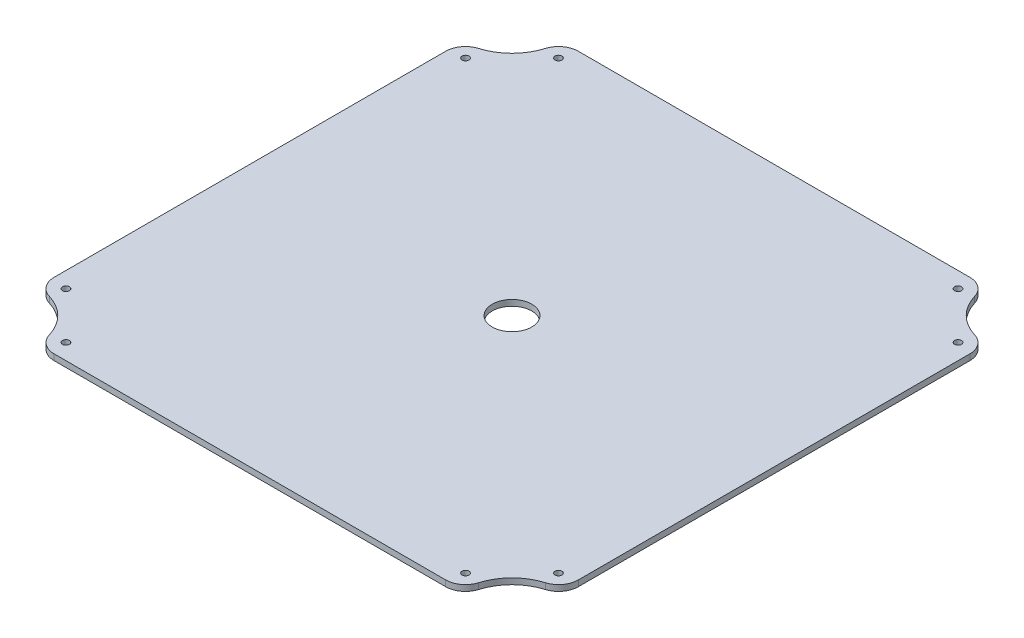
ISO-10303-21;
HEADER;
FILE_DESCRIPTION(('STEP AP214'),'2;1');
FILE_NAME('part.step','',(''),(''),'','','');
FILE_SCHEMA(('AUTOMOTIVE_DESIGN { 1 0 10303 214 1 1 1 1 }'));
ENDSEC;
DATA;
#1=APPLICATION_CONTEXT('core data for automotive mechanical design processes');
#2=APPLICATION_PROTOCOL_DEFINITION('international standard','automotive_design',2000,#1);
#3=PRODUCT_CONTEXT('',#1,'mechanical');
#4=PRODUCT('Part','Part','',(#3));
#5=PRODUCT_RELATED_PRODUCT_CATEGORY('part','',(#4));
#6=PRODUCT_DEFINITION_FORMATION('','',#4);
#7=PRODUCT_DEFINITION_CONTEXT('part definition',#1,'design');
#8=PRODUCT_DEFINITION('design','',#6,#7);
#9=PRODUCT_DEFINITION_SHAPE('','',#8);
#10=(LENGTH_UNIT() NAMED_UNIT(*) SI_UNIT(.MILLI.,.METRE.));
#11=(NAMED_UNIT(*) PLANE_ANGLE_UNIT() SI_UNIT($,.RADIAN.));
#12=(NAMED_UNIT(*) SI_UNIT($,.STERADIAN.) SOLID_ANGLE_UNIT());
#13=UNCERTAINTY_MEASURE_WITH_UNIT(LENGTH_MEASURE(1.E-05),#10,'distance_accuracy_value','');
#14=(GEOMETRIC_REPRESENTATION_CONTEXT(3) GLOBAL_UNCERTAINTY_ASSIGNED_CONTEXT((#13)) GLOBAL_UNIT_ASSIGNED_CONTEXT((#10,
#11,#12)) REPRESENTATION_CONTEXT('',''));
#15=CARTESIAN_POINT('',(0.,0.,0.));
#16=DIRECTION('',(0.,0.,1.));
#17=DIRECTION('',(1.,0.,0.));
#18=AXIS2_PLACEMENT_3D('',#15,#16,#17);
#19=CARTESIAN_POINT('',(0.,3.,132.5));
#20=DIRECTION('',(0.,0.,-1.));
#21=DIRECTION('',(-1.,0.,0.));
#22=AXIS2_PLACEMENT_3D('',#19,#20,#21);
#23=PLANE('',#22);
#24=DIRECTION('',(1.,0.,0.));
#25=VECTOR('',#24,1.);
#26=CARTESIAN_POINT('',(0.,0.,132.5));
#27=LINE('',#26,#25);
#28=CARTESIAN_POINT('',(-98.9589803375031,0.,132.5));
#29=VERTEX_POINT('',#28);
#30=CARTESIAN_POINT('',(98.958980337503,0.,132.5));
#31=VERTEX_POINT('',#30);
#32=EDGE_CURVE('E181',#29,#31,#27,.T.);
#33=ORIENTED_EDGE('',*,*,#32,.T.);
#34=DIRECTION('',(0.,1.,0.));
#35=VECTOR('',#34,1.);
#36=CARTESIAN_POINT('',(98.958980337503,3.,132.5));
#37=LINE('',#36,#35);
#38=CARTESIAN_POINT('',(98.958980337503,3.,132.5));
#39=VERTEX_POINT('',#38);
#40=EDGE_CURVE('E233',#31,#39,#37,.T.);
#41=ORIENTED_EDGE('',*,*,#40,.T.);
#42=DIRECTION('',(1.,0.,0.));
#43=VECTOR('',#42,1.);
#44=CARTESIAN_POINT('',(0.,3.,132.5));
#45=LINE('',#44,#43);
#46=CARTESIAN_POINT('',(-98.9589803375031,3.,132.5));
#47=VERTEX_POINT('',#46);
#48=EDGE_CURVE('E282',#47,#39,#45,.T.);
#49=ORIENTED_EDGE('',*,*,#48,.F.);
#50=DIRECTION('',(0.,1.,0.));
#51=VECTOR('',#50,1.);
#52=CARTESIAN_POINT('',(-98.9589803375031,3.,132.5));
#53=LINE('',#52,#51);
#54=EDGE_CURVE('E230',#47,#29,#53,.F.);
#55=ORIENTED_EDGE('',*,*,#54,.T.);
#56=EDGE_LOOP('',(#33,#41,#49,#55));
#57=FACE_BOUND('',#56,.T.);
#58=ADVANCED_FACE('F38',(#57),#23,.F.);
#59=CARTESIAN_POINT('',(132.5,3.,0.));
#60=DIRECTION('',(-1.,0.,0.));
#61=DIRECTION('',(0.,0.,1.));
#62=AXIS2_PLACEMENT_3D('',#59,#60,#61);
#63=PLANE('',#62);
#64=DIRECTION('',(0.,0.,-1.));
#65=VECTOR('',#64,1.);
#66=CARTESIAN_POINT('',(132.5,0.,0.));
#67=LINE('',#66,#65);
#68=CARTESIAN_POINT('',(132.5,0.,98.958980337503));
#69=VERTEX_POINT('',#68);
#70=CARTESIAN_POINT('',(132.5,0.,-98.9589803375032));
#71=VERTEX_POINT('',#70);
#72=EDGE_CURVE('E170',#69,#71,#67,.T.);
#73=ORIENTED_EDGE('',*,*,#72,.T.);
#74=DIRECTION('',(0.,1.,0.));
#75=VECTOR('',#74,1.);
#76=CARTESIAN_POINT('',(132.5,3.,-98.9589803375032));
#77=LINE('',#76,#75);
#78=CARTESIAN_POINT('',(132.5,3.,-98.9589803375032));
#79=VERTEX_POINT('',#78);
#80=EDGE_CURVE('E174',#71,#79,#77,.T.);
#81=ORIENTED_EDGE('',*,*,#80,.T.);
#82=DIRECTION('',(0.,0.,-1.));
#83=VECTOR('',#82,1.);
#84=CARTESIAN_POINT('',(132.5,3.,0.));
#85=LINE('',#84,#83);
#86=CARTESIAN_POINT('',(132.5,3.,98.958980337503));
#87=VERTEX_POINT('',#86);
#88=EDGE_CURVE('E173',#87,#79,#85,.T.);
#89=ORIENTED_EDGE('',*,*,#88,.F.);
#90=DIRECTION('',(0.,1.,0.));
#91=VECTOR('',#90,1.);
#92=CARTESIAN_POINT('',(132.5,3.,98.958980337503));
#93=LINE('',#92,#91);
#94=EDGE_CURVE('E157',#87,#69,#93,.F.);
#95=ORIENTED_EDGE('',*,*,#94,.T.);
#96=EDGE_LOOP('',(#73,#81,#89,#95));
#97=FACE_BOUND('',#96,.T.);
#98=ADVANCED_FACE('F168',(#97),#63,.F.);
#99=CARTESIAN_POINT('',(0.,3.,-132.5));
#100=DIRECTION('',(0.,0.,-1.));
#101=DIRECTION('',(-1.,0.,0.));
#102=AXIS2_PLACEMENT_3D('',#99,#100,#101);
#103=PLANE('',#102);
#104=DIRECTION('',(1.,0.,0.));
#105=VECTOR('',#104,1.);
#106=CARTESIAN_POINT('',(0.,0.,-132.5));
#107=LINE('',#106,#105);
#108=CARTESIAN_POINT('',(-98.9589803375032,0.,-132.5));
#109=VERTEX_POINT('',#108);
#110=CARTESIAN_POINT('',(98.958980337503,0.,-132.5));
#111=VERTEX_POINT('',#110);
#112=EDGE_CURVE('E180',#109,#111,#107,.T.);
#113=ORIENTED_EDGE('',*,*,#112,.F.);
#114=DIRECTION('',(0.,-1.,0.));
#115=VECTOR('',#114,1.);
#116=CARTESIAN_POINT('',(-98.9589803375032,3.,-132.5));
#117=LINE('',#116,#115);
#118=CARTESIAN_POINT('',(-98.9589803375032,3.,-132.5));
#119=VERTEX_POINT('',#118);
#120=EDGE_CURVE('E11',#109,#119,#117,.F.);
#121=ORIENTED_EDGE('',*,*,#120,.T.);
#122=DIRECTION('',(1.,0.,0.));
#123=VECTOR('',#122,1.);
#124=CARTESIAN_POINT('',(0.,3.,-132.5));
#125=LINE('',#124,#123);
#126=CARTESIAN_POINT('',(98.958980337503,3.,-132.5));
#127=VERTEX_POINT('',#126);
#128=EDGE_CURVE('E255',#119,#127,#125,.T.);
#129=ORIENTED_EDGE('',*,*,#128,.T.);
#130=DIRECTION('',(0.,-1.,0.));
#131=VECTOR('',#130,1.);
#132=CARTESIAN_POINT('',(98.958980337503,0.,-132.5));
#133=LINE('',#132,#131);
#134=EDGE_CURVE('E46',#127,#111,#133,.T.);
#135=ORIENTED_EDGE('',*,*,#134,.T.);
#136=EDGE_LOOP('',(#113,#121,#129,#135));
#137=FACE_BOUND('',#136,.T.);
#138=ADVANCED_FACE('F253',(#137),#103,.T.);
#139=CARTESIAN_POINT('',(0.,3.,0.));
#140=DIRECTION('',(0.,-1.,0.));
#141=DIRECTION('',(0.,0.,-1.));
#142=AXIS2_PLACEMENT_3D('',#139,#140,#141);
#143=CYLINDRICAL_SURFACE('',#142,9.99999999999998);
#144=CARTESIAN_POINT('',(0.,3.,0.));
#145=DIRECTION('',(0.,1.,0.));
#146=DIRECTION('',(0.,0.,1.));
#147=AXIS2_PLACEMENT_3D('',#144,#145,#146);
#148=CIRCLE('',#147,9.99999999999998);
#149=CARTESIAN_POINT('',(0.,3.,9.99999999999998));
#150=VERTEX_POINT('',#149);
#151=EDGE_CURVE('E192',#150,#150,#148,.T.);
#152=ORIENTED_EDGE('',*,*,#151,.T.);
#153=EDGE_LOOP('',(#152));
#154=FACE_BOUND('',#153,.T.);
#155=CARTESIAN_POINT('',(0.,0.,0.));
#156=DIRECTION('',(0.,1.,0.));
#157=DIRECTION('',(0.,0.,1.));
#158=AXIS2_PLACEMENT_3D('',#155,#156,#157);
#159=CIRCLE('',#158,9.99999999999998);
#160=CARTESIAN_POINT('',(0.,0.,9.99999999999998));
#161=VERTEX_POINT('',#160);
#162=EDGE_CURVE('E187',#161,#161,#159,.T.);
#163=ORIENTED_EDGE('',*,*,#162,.F.);
#164=EDGE_LOOP('',(#163));
#165=FACE_BOUND('',#164,.T.);
#166=ADVANCED_FACE('F292',(#154,#165),#143,.F.);
#167=CARTESIAN_POINT('',(-132.5,3.,0.));
#168=DIRECTION('',(-1.,0.,0.));
#169=DIRECTION('',(0.,0.,1.));
#170=AXIS2_PLACEMENT_3D('',#167,#168,#169);
#171=PLANE('',#170);
#172=DIRECTION('',(0.,0.,-1.));
#173=VECTOR('',#172,1.);
#174=CARTESIAN_POINT('',(-132.5,0.,0.));
#175=LINE('',#174,#173);
#176=CARTESIAN_POINT('',(-132.5,0.,98.9589803375032));
#177=VERTEX_POINT('',#176);
#178=CARTESIAN_POINT('',(-132.5,0.,-98.9589803375031));
#179=VERTEX_POINT('',#178);
#180=EDGE_CURVE('E184',#177,#179,#175,.T.);
#181=ORIENTED_EDGE('',*,*,#180,.F.);
#182=DIRECTION('',(0.,-1.,0.));
#183=VECTOR('',#182,1.);
#184=CARTESIAN_POINT('',(-132.5,3.,98.9589803375032));
#185=LINE('',#184,#183);
#186=CARTESIAN_POINT('',(-132.5,3.,98.9589803375032));
#187=VERTEX_POINT('',#186);
#188=EDGE_CURVE('E243',#177,#187,#185,.F.);
#189=ORIENTED_EDGE('',*,*,#188,.T.);
#190=DIRECTION('',(0.,0.,-1.));
#191=VECTOR('',#190,1.);
#192=CARTESIAN_POINT('',(-132.5,3.,0.));
#193=LINE('',#192,#191);
#194=CARTESIAN_POINT('',(-132.5,3.,-98.9589803375031));
#195=VERTEX_POINT('',#194);
#196=EDGE_CURVE('E193',#187,#195,#193,.T.);
#197=ORIENTED_EDGE('',*,*,#196,.T.);
#198=DIRECTION('',(0.,-1.,0.));
#199=VECTOR('',#198,1.);
#200=CARTESIAN_POINT('',(-132.5,0.,-98.9589803375031));
#201=LINE('',#200,#199);
#202=EDGE_CURVE('E241',#195,#179,#201,.T.);
#203=ORIENTED_EDGE('',*,*,#202,.T.);
#204=EDGE_LOOP('',(#181,#189,#197,#203));
#205=FACE_BOUND('',#204,.T.);
#206=ADVANCED_FACE('F294',(#205),#171,.T.);
#207=CARTESIAN_POINT('',(0.,3.,0.));
#208=DIRECTION('',(0.,1.,0.));
#209=DIRECTION('',(0.,0.,1.));
#210=AXIS2_PLACEMENT_3D('',#207,#208,#209);
#211=PLANE('',#210);
#212=CARTESIAN_POINT('',(-124.5,3.,-101.));
#213=DIRECTION('',(0.,1.,0.));
#214=DIRECTION('',(0.,0.,1.));
#215=AXIS2_PLACEMENT_3D('',#212,#213,#214);
#216=CIRCLE('',#215,1.75);
#217=CARTESIAN_POINT('',(-124.5,3.,-99.2499999999999));
#218=VERTEX_POINT('',#217);
#219=EDGE_CURVE('E270',#218,#218,#216,.T.);
#220=ORIENTED_EDGE('',*,*,#219,.F.);
#221=EDGE_LOOP('',(#220));
#222=FACE_BOUND('',#221,.T.);
#223=ORIENTED_EDGE('',*,*,#88,.T.);
#224=CARTESIAN_POINT('',(122.5,3.,-98.9589803375032));
#225=DIRECTION('',(0.,1.,0.));
#226=DIRECTION('',(0.,0.,1.));
#227=AXIS2_PLACEMENT_3D('',#224,#225,#226);
#228=CIRCLE('',#227,10.);
#229=CARTESIAN_POINT('',(125.357142857143,3.,-108.542128812502));
#230=VERTEX_POINT('',#229);
#231=EDGE_CURVE('E210',#79,#230,#228,.T.);
#232=ORIENTED_EDGE('',*,*,#231,.T.);
#233=CARTESIAN_POINT('',(132.5,3.,-132.5));
#234=DIRECTION('',(0.,1.,0.));
#235=DIRECTION('',(0.,0.,1.));
#236=AXIS2_PLACEMENT_3D('',#233,#234,#235);
#237=CIRCLE('',#236,25.);
#238=CARTESIAN_POINT('',(108.542128812502,3.,-125.357142857143));
#239=VERTEX_POINT('',#238);
#240=EDGE_CURVE('E265',#239,#230,#237,.T.);
#241=ORIENTED_EDGE('',*,*,#240,.F.);
#242=CARTESIAN_POINT('',(98.958980337503,3.,-122.5));
#243=DIRECTION('',(0.,1.,0.));
#244=DIRECTION('',(0.,0.,1.));
#245=AXIS2_PLACEMENT_3D('',#242,#243,#244);
#246=CIRCLE('',#245,10.);
#247=EDGE_CURVE('E198',#239,#127,#246,.T.);
#248=ORIENTED_EDGE('',*,*,#247,.T.);
#249=ORIENTED_EDGE('',*,*,#128,.F.);
#250=CARTESIAN_POINT('',(-98.9589803375032,3.,-122.5));
#251=DIRECTION('',(0.,1.,0.));
#252=DIRECTION('',(0.,0.,1.));
#253=AXIS2_PLACEMENT_3D('',#250,#251,#252);
#254=CIRCLE('',#253,10.);
#255=CARTESIAN_POINT('',(-108.542128812502,3.,-125.357142857143));
#256=VERTEX_POINT('',#255);
#257=EDGE_CURVE('E200',#119,#256,#254,.T.);
#258=ORIENTED_EDGE('',*,*,#257,.T.);
#259=CARTESIAN_POINT('',(-132.5,3.,-132.5));
#260=DIRECTION('',(0.,1.,0.));
#261=DIRECTION('',(0.,0.,1.));
#262=AXIS2_PLACEMENT_3D('',#259,#260,#261);
#263=CIRCLE('',#262,25.);
#264=CARTESIAN_POINT('',(-125.357142857143,3.,-108.542128812502));
#265=VERTEX_POINT('',#264);
#266=EDGE_CURVE('E420',#265,#256,#263,.T.);
#267=ORIENTED_EDGE('',*,*,#266,.F.);
#268=CARTESIAN_POINT('',(-122.5,3.,-98.9589803375031));
#269=DIRECTION('',(0.,1.,0.));
#270=DIRECTION('',(0.,0.,1.));
#271=AXIS2_PLACEMENT_3D('',#268,#269,#270);
#272=CIRCLE('',#271,10.);
#273=EDGE_CURVE('E202',#265,#195,#272,.T.);
#274=ORIENTED_EDGE('',*,*,#273,.T.);
#275=ORIENTED_EDGE('',*,*,#196,.F.);
#276=CARTESIAN_POINT('',(-122.5,3.,98.9589803375032));
#277=DIRECTION('',(0.,1.,0.));
#278=DIRECTION('',(0.,0.,1.));
#279=AXIS2_PLACEMENT_3D('',#276,#277,#278);
#280=CIRCLE('',#279,10.);
#281=CARTESIAN_POINT('',(-125.357142857143,3.,108.542128812502));
#282=VERTEX_POINT('',#281);
#283=EDGE_CURVE('E204',#187,#282,#280,.T.);
#284=ORIENTED_EDGE('',*,*,#283,.T.);
#285=CARTESIAN_POINT('',(-132.5,3.,132.5));
#286=DIRECTION('',(0.,1.,0.));
#287=DIRECTION('',(0.,0.,1.));
#288=AXIS2_PLACEMENT_3D('',#285,#286,#287);
#289=CIRCLE('',#288,25.);
#290=CARTESIAN_POINT('',(-108.542128812502,3.,125.357142857143));
#291=VERTEX_POINT('',#290);
#292=EDGE_CURVE('E403',#291,#282,#289,.T.);
#293=ORIENTED_EDGE('',*,*,#292,.F.);
#294=CARTESIAN_POINT('',(-98.9589803375031,3.,122.5));
#295=DIRECTION('',(0.,1.,0.));
#296=DIRECTION('',(0.,0.,1.));
#297=AXIS2_PLACEMENT_3D('',#294,#295,#296);
#298=CIRCLE('',#297,10.);
#299=EDGE_CURVE('E196',#291,#47,#298,.T.);
#300=ORIENTED_EDGE('',*,*,#299,.T.);
#301=ORIENTED_EDGE('',*,*,#48,.T.);
#302=CARTESIAN_POINT('',(98.958980337503,3.,122.5));
#303=DIRECTION('',(0.,1.,0.));
#304=DIRECTION('',(0.,0.,1.));
#305=AXIS2_PLACEMENT_3D('',#302,#303,#304);
#306=CIRCLE('',#305,10.);
#307=CARTESIAN_POINT('',(108.542128812502,3.,125.357142857143));
#308=VERTEX_POINT('',#307);
#309=EDGE_CURVE('E206',#39,#308,#306,.T.);
#310=ORIENTED_EDGE('',*,*,#309,.T.);
#311=CARTESIAN_POINT('',(132.5,3.,132.5));
#312=DIRECTION('',(0.,1.,0.));
#313=DIRECTION('',(0.,0.,1.));
#314=AXIS2_PLACEMENT_3D('',#311,#312,#313);
#315=CIRCLE('',#314,25.0000000000002);
#316=CARTESIAN_POINT('',(125.357142857143,3.,108.542128812502));
#317=VERTEX_POINT('',#316);
#318=EDGE_CURVE('E412',#317,#308,#315,.T.);
#319=ORIENTED_EDGE('',*,*,#318,.F.);
#320=CARTESIAN_POINT('',(122.5,3.,98.958980337503));
#321=DIRECTION('',(0.,1.,0.));
#322=DIRECTION('',(0.,0.,1.));
#323=AXIS2_PLACEMENT_3D('',#320,#321,#322);
#324=CIRCLE('',#323,10.);
#325=EDGE_CURVE('E208',#317,#87,#324,.T.);
#326=ORIENTED_EDGE('',*,*,#325,.T.);
#327=EDGE_LOOP('',(#223,#232,#241,#248,#249,#258,#267,#274,#275,#284,#293,#300,#301,#310,#319,#326));
#328=FACE_BOUND('',#327,.T.);
#329=CARTESIAN_POINT('',(124.5,3.,-101.));
#330=DIRECTION('',(0.,1.,0.));
#331=DIRECTION('',(0.,0.,1.));
#332=AXIS2_PLACEMENT_3D('',#329,#330,#331);
#333=CIRCLE('',#332,1.75);
#334=CARTESIAN_POINT('',(124.5,3.,-99.2500000000001));
#335=VERTEX_POINT('',#334);
#336=EDGE_CURVE('E271',#335,#335,#333,.T.);
#337=ORIENTED_EDGE('',*,*,#336,.F.);
#338=EDGE_LOOP('',(#337));
#339=FACE_BOUND('',#338,.T.);
#340=CARTESIAN_POINT('',(101.,3.,-124.5));
#341=DIRECTION('',(0.,1.,0.));
#342=DIRECTION('',(0.,0.,1.));
#343=AXIS2_PLACEMENT_3D('',#340,#341,#342);
#344=CIRCLE('',#343,1.75);
#345=CARTESIAN_POINT('',(101.,3.,-122.75));
#346=VERTEX_POINT('',#345);
#347=EDGE_CURVE('E276',#346,#346,#344,.T.);
#348=ORIENTED_EDGE('',*,*,#347,.F.);
#349=EDGE_LOOP('',(#348));
#350=FACE_BOUND('',#349,.T.);
#351=CARTESIAN_POINT('',(-101.,3.,-124.5));
#352=DIRECTION('',(0.,1.,0.));
#353=DIRECTION('',(0.,0.,1.));
#354=AXIS2_PLACEMENT_3D('',#351,#352,#353);
#355=CIRCLE('',#354,1.75);
#356=CARTESIAN_POINT('',(-101.,3.,-122.75));
#357=VERTEX_POINT('',#356);
#358=EDGE_CURVE('E423',#357,#357,#355,.T.);
#359=ORIENTED_EDGE('',*,*,#358,.F.);
#360=EDGE_LOOP('',(#359));
#361=FACE_BOUND('',#360,.T.);
#362=CARTESIAN_POINT('',(-101.,3.,124.5));
#363=DIRECTION('',(0.,1.,0.));
#364=DIRECTION('',(0.,0.,1.));
#365=AXIS2_PLACEMENT_3D('',#362,#363,#364);
#366=CIRCLE('',#365,1.75);
#367=CARTESIAN_POINT('',(-101.,3.,126.25));
#368=VERTEX_POINT('',#367);
#369=EDGE_CURVE('E417',#368,#368,#366,.T.);
#370=ORIENTED_EDGE('',*,*,#369,.F.);
#371=EDGE_LOOP('',(#370));
#372=FACE_BOUND('',#371,.T.);
#373=CARTESIAN_POINT('',(-124.5,3.,101.));
#374=DIRECTION('',(0.,1.,0.));
#375=DIRECTION('',(0.,0.,1.));
#376=AXIS2_PLACEMENT_3D('',#373,#374,#375);
#377=CIRCLE('',#376,1.75);
#378=CARTESIAN_POINT('',(-124.5,3.,102.75));
#379=VERTEX_POINT('',#378);
#380=EDGE_CURVE('E414',#379,#379,#377,.T.);
#381=ORIENTED_EDGE('',*,*,#380,.F.);
#382=EDGE_LOOP('',(#381));
#383=FACE_BOUND('',#382,.T.);
#384=CARTESIAN_POINT('',(101.,3.,124.5));
#385=DIRECTION('',(0.,1.,0.));
#386=DIRECTION('',(0.,0.,1.));
#387=AXIS2_PLACEMENT_3D('',#384,#385,#386);
#388=CIRCLE('',#387,1.75);
#389=CARTESIAN_POINT('',(101.,3.,126.25));
#390=VERTEX_POINT('',#389);
#391=EDGE_CURVE('E409',#390,#390,#388,.T.);
#392=ORIENTED_EDGE('',*,*,#391,.F.);
#393=EDGE_LOOP('',(#392));
#394=FACE_BOUND('',#393,.T.);
#395=CARTESIAN_POINT('',(124.5,3.,101.));
#396=DIRECTION('',(0.,1.,0.));
#397=DIRECTION('',(0.,0.,1.));
#398=AXIS2_PLACEMENT_3D('',#395,#396,#397);
#399=CIRCLE('',#398,1.75);
#400=CARTESIAN_POINT('',(124.5,3.,102.75));
#401=VERTEX_POINT('',#400);
#402=EDGE_CURVE('E406',#401,#401,#399,.T.);
#403=ORIENTED_EDGE('',*,*,#402,.F.);
#404=EDGE_LOOP('',(#403));
#405=FACE_BOUND('',#404,.T.);
#406=ORIENTED_EDGE('',*,*,#151,.F.);
#407=EDGE_LOOP('',(#406));
#408=FACE_BOUND('',#407,.T.);
#409=ADVANCED_FACE('F268',(#222,#328,#339,#350,#361,#372,#383,#394,#405,#408),#211,.T.);
#410=CARTESIAN_POINT('',(0.,0.,0.));
#411=DIRECTION('',(0.,1.,0.));
#412=DIRECTION('',(0.,0.,1.));
#413=AXIS2_PLACEMENT_3D('',#410,#411,#412);
#414=PLANE('',#413);
#415=CARTESIAN_POINT('',(-124.5,0.,-101.));
#416=DIRECTION('',(0.,1.,0.));
#417=DIRECTION('',(0.,0.,1.));
#418=AXIS2_PLACEMENT_3D('',#415,#416,#417);
#419=CIRCLE('',#418,1.75);
#420=CARTESIAN_POINT('',(-124.5,0.,-99.2499999999999));
#421=VERTEX_POINT('',#420);
#422=EDGE_CURVE('E385',#421,#421,#419,.T.);
#423=ORIENTED_EDGE('',*,*,#422,.T.);
#424=EDGE_LOOP('',(#423));
#425=FACE_BOUND('',#424,.T.);
#426=CARTESIAN_POINT('',(124.5,0.,-101.));
#427=DIRECTION('',(0.,1.,0.));
#428=DIRECTION('',(0.,0.,1.));
#429=AXIS2_PLACEMENT_3D('',#426,#427,#428);
#430=CIRCLE('',#429,1.75);
#431=CARTESIAN_POINT('',(124.5,0.,-99.2500000000001));
#432=VERTEX_POINT('',#431);
#433=EDGE_CURVE('E376',#432,#432,#430,.T.);
#434=ORIENTED_EDGE('',*,*,#433,.T.);
#435=EDGE_LOOP('',(#434));
#436=FACE_BOUND('',#435,.T.);
#437=CARTESIAN_POINT('',(101.,0.,-124.5));
#438=DIRECTION('',(0.,1.,0.));
#439=DIRECTION('',(0.,0.,1.));
#440=AXIS2_PLACEMENT_3D('',#437,#438,#439);
#441=CIRCLE('',#440,1.75);
#442=CARTESIAN_POINT('',(101.,0.,-122.75));
#443=VERTEX_POINT('',#442);
#444=EDGE_CURVE('E372',#443,#443,#441,.T.);
#445=ORIENTED_EDGE('',*,*,#444,.T.);
#446=EDGE_LOOP('',(#445));
#447=FACE_BOUND('',#446,.T.);
#448=CARTESIAN_POINT('',(-101.,0.,-124.5));
#449=DIRECTION('',(0.,1.,0.));
#450=DIRECTION('',(0.,0.,1.));
#451=AXIS2_PLACEMENT_3D('',#448,#449,#450);
#452=CIRCLE('',#451,1.75);
#453=CARTESIAN_POINT('',(-101.,0.,-122.75));
#454=VERTEX_POINT('',#453);
#455=EDGE_CURVE('E389',#454,#454,#452,.T.);
#456=ORIENTED_EDGE('',*,*,#455,.T.);
#457=EDGE_LOOP('',(#456));
#458=FACE_BOUND('',#457,.T.);
#459=CARTESIAN_POINT('',(-101.,0.,124.5));
#460=DIRECTION('',(0.,1.,0.));
#461=DIRECTION('',(0.,0.,1.));
#462=AXIS2_PLACEMENT_3D('',#459,#460,#461);
#463=CIRCLE('',#462,1.75);
#464=CARTESIAN_POINT('',(-101.,0.,126.25));
#465=VERTEX_POINT('',#464);
#466=EDGE_CURVE('E394',#465,#465,#463,.T.);
#467=ORIENTED_EDGE('',*,*,#466,.T.);
#468=EDGE_LOOP('',(#467));
#469=FACE_BOUND('',#468,.T.);
#470=CARTESIAN_POINT('',(-124.5,0.,101.));
#471=DIRECTION('',(0.,1.,0.));
#472=DIRECTION('',(0.,0.,1.));
#473=AXIS2_PLACEMENT_3D('',#470,#471,#472);
#474=CIRCLE('',#473,1.75);
#475=CARTESIAN_POINT('',(-124.5,0.,102.75));
#476=VERTEX_POINT('',#475);
#477=EDGE_CURVE('E390',#476,#476,#474,.T.);
#478=ORIENTED_EDGE('',*,*,#477,.T.);
#479=EDGE_LOOP('',(#478));
#480=FACE_BOUND('',#479,.T.);
#481=CARTESIAN_POINT('',(101.,0.,124.5));
#482=DIRECTION('',(0.,1.,0.));
#483=DIRECTION('',(0.,0.,1.));
#484=AXIS2_PLACEMENT_3D('',#481,#482,#483);
#485=CIRCLE('',#484,1.75);
#486=CARTESIAN_POINT('',(101.,0.,126.25));
#487=VERTEX_POINT('',#486);
#488=EDGE_CURVE('E373',#487,#487,#485,.T.);
#489=ORIENTED_EDGE('',*,*,#488,.T.);
#490=EDGE_LOOP('',(#489));
#491=FACE_BOUND('',#490,.T.);
#492=CARTESIAN_POINT('',(124.5,0.,101.));
#493=DIRECTION('',(0.,1.,0.));
#494=DIRECTION('',(0.,0.,1.));
#495=AXIS2_PLACEMENT_3D('',#492,#493,#494);
#496=CIRCLE('',#495,1.75);
#497=CARTESIAN_POINT('',(124.5,0.,102.75));
#498=VERTEX_POINT('',#497);
#499=EDGE_CURVE('E379',#498,#498,#496,.T.);
#500=ORIENTED_EDGE('',*,*,#499,.T.);
#501=EDGE_LOOP('',(#500));
#502=FACE_BOUND('',#501,.T.);
#503=ORIENTED_EDGE('',*,*,#162,.T.);
#504=EDGE_LOOP('',(#503));
#505=FACE_BOUND('',#504,.T.);
#506=CARTESIAN_POINT('',(132.5,0.,-132.5));
#507=DIRECTION('',(0.,1.,0.));
#508=DIRECTION('',(0.,0.,1.));
#509=AXIS2_PLACEMENT_3D('',#506,#507,#508);
#510=CIRCLE('',#509,25.);
#511=CARTESIAN_POINT('',(108.542128812502,0.,-125.357142857143));
#512=VERTEX_POINT('',#511);
#513=CARTESIAN_POINT('',(125.357142857143,0.,-108.542128812502));
#514=VERTEX_POINT('',#513);
#515=EDGE_CURVE('E175',#512,#514,#510,.T.);
#516=ORIENTED_EDGE('',*,*,#515,.T.);
#517=CARTESIAN_POINT('',(122.5,0.,-98.9589803375032));
#518=DIRECTION('',(0.,1.,0.));
#519=DIRECTION('',(0.,0.,1.));
#520=AXIS2_PLACEMENT_3D('',#517,#518,#519);
#521=CIRCLE('',#520,10.);
#522=EDGE_CURVE('E162',#514,#71,#521,.F.);
#523=ORIENTED_EDGE('',*,*,#522,.T.);
#524=ORIENTED_EDGE('',*,*,#72,.F.);
#525=CARTESIAN_POINT('',(122.5,0.,98.958980337503));
#526=DIRECTION('',(0.,1.,0.));
#527=DIRECTION('',(0.,0.,1.));
#528=AXIS2_PLACEMENT_3D('',#525,#526,#527);
#529=CIRCLE('',#528,10.);
#530=CARTESIAN_POINT('',(125.357142857143,0.,108.542128812502));
#531=VERTEX_POINT('',#530);
#532=EDGE_CURVE('E153',#69,#531,#529,.F.);
#533=ORIENTED_EDGE('',*,*,#532,.T.);
#534=CARTESIAN_POINT('',(132.5,0.,132.5));
#535=DIRECTION('',(0.,1.,0.));
#536=DIRECTION('',(0.,0.,1.));
#537=AXIS2_PLACEMENT_3D('',#534,#535,#536);
#538=CIRCLE('',#537,25.0000000000002);
#539=CARTESIAN_POINT('',(108.542128812502,0.,125.357142857143));
#540=VERTEX_POINT('',#539);
#541=EDGE_CURVE('E367',#531,#540,#538,.T.);
#542=ORIENTED_EDGE('',*,*,#541,.T.);
#543=CARTESIAN_POINT('',(98.958980337503,0.,122.5));
#544=DIRECTION('',(0.,1.,0.));
#545=DIRECTION('',(0.,0.,1.));
#546=AXIS2_PLACEMENT_3D('',#543,#544,#545);
#547=CIRCLE('',#546,10.);
#548=EDGE_CURVE('E163',#540,#31,#547,.F.);
#549=ORIENTED_EDGE('',*,*,#548,.T.);
#550=ORIENTED_EDGE('',*,*,#32,.F.);
#551=CARTESIAN_POINT('',(-98.9589803375031,0.,122.5));
#552=DIRECTION('',(0.,1.,0.));
#553=DIRECTION('',(0.,0.,1.));
#554=AXIS2_PLACEMENT_3D('',#551,#552,#553);
#555=CIRCLE('',#554,10.);
#556=CARTESIAN_POINT('',(-108.542128812502,0.,125.357142857143));
#557=VERTEX_POINT('',#556);
#558=EDGE_CURVE('E217',#29,#557,#555,.F.);
#559=ORIENTED_EDGE('',*,*,#558,.T.);
#560=CARTESIAN_POINT('',(-132.5,0.,132.5));
#561=DIRECTION('',(0.,1.,0.));
#562=DIRECTION('',(0.,0.,1.));
#563=AXIS2_PLACEMENT_3D('',#560,#561,#562);
#564=CIRCLE('',#563,25.);
#565=CARTESIAN_POINT('',(-125.357142857143,0.,108.542128812502));
#566=VERTEX_POINT('',#565);
#567=EDGE_CURVE('E393',#557,#566,#564,.T.);
#568=ORIENTED_EDGE('',*,*,#567,.T.);
#569=CARTESIAN_POINT('',(-122.5,0.,98.9589803375032));
#570=DIRECTION('',(0.,1.,0.));
#571=DIRECTION('',(0.,0.,1.));
#572=AXIS2_PLACEMENT_3D('',#569,#570,#571);
#573=CIRCLE('',#572,10.);
#574=EDGE_CURVE('E223',#566,#177,#573,.F.);
#575=ORIENTED_EDGE('',*,*,#574,.T.);
#576=ORIENTED_EDGE('',*,*,#180,.T.);
#577=CARTESIAN_POINT('',(-122.5,0.,-98.9589803375031));
#578=DIRECTION('',(0.,1.,0.));
#579=DIRECTION('',(0.,0.,1.));
#580=AXIS2_PLACEMENT_3D('',#577,#578,#579);
#581=CIRCLE('',#580,10.);
#582=CARTESIAN_POINT('',(-125.357142857143,0.,-108.542128812502));
#583=VERTEX_POINT('',#582);
#584=EDGE_CURVE('E61',#179,#583,#581,.F.);
#585=ORIENTED_EDGE('',*,*,#584,.T.);
#586=CARTESIAN_POINT('',(-132.5,0.,-132.5));
#587=DIRECTION('',(0.,1.,0.));
#588=DIRECTION('',(0.,0.,1.));
#589=AXIS2_PLACEMENT_3D('',#586,#587,#588);
#590=CIRCLE('',#589,25.);
#591=CARTESIAN_POINT('',(-108.542128812502,0.,-125.357142857143));
#592=VERTEX_POINT('',#591);
#593=EDGE_CURVE('E397',#583,#592,#590,.T.);
#594=ORIENTED_EDGE('',*,*,#593,.T.);
#595=CARTESIAN_POINT('',(-98.9589803375032,0.,-122.5));
#596=DIRECTION('',(0.,1.,0.));
#597=DIRECTION('',(0.,0.,1.));
#598=AXIS2_PLACEMENT_3D('',#595,#596,#597);
#599=CIRCLE('',#598,10.);
#600=EDGE_CURVE('E53',#592,#109,#599,.F.);
#601=ORIENTED_EDGE('',*,*,#600,.T.);
#602=ORIENTED_EDGE('',*,*,#112,.T.);
#603=CARTESIAN_POINT('',(98.958980337503,0.,-122.5));
#604=DIRECTION('',(0.,1.,0.));
#605=DIRECTION('',(0.,0.,1.));
#606=AXIS2_PLACEMENT_3D('',#603,#604,#605);
#607=CIRCLE('',#606,10.);
#608=EDGE_CURVE('E219',#111,#512,#607,.F.);
#609=ORIENTED_EDGE('',*,*,#608,.T.);
#610=EDGE_LOOP('',(#516,#523,#524,#533,#542,#549,#550,#559,#568,#575,#576,#585,#594,#601,#602,#609));
#611=FACE_BOUND('',#610,.T.);
#612=ADVANCED_FACE('F178',(#425,#436,#447,#458,#469,#480,#491,#502,#505,#611),#414,.F.);
#613=CARTESIAN_POINT('',(-132.5,0.,132.5));
#614=DIRECTION('',(0.,1.,0.));
#615=DIRECTION('',(0.,0.,1.));
#616=AXIS2_PLACEMENT_3D('',#613,#614,#615);
#617=CYLINDRICAL_SURFACE('',#616,25.);
#618=ORIENTED_EDGE('',*,*,#292,.T.);
#619=DIRECTION('',(0.,1.,0.));
#620=VECTOR('',#619,1.);
#621=CARTESIAN_POINT('',(-125.357142857143,0.,108.542128812502));
#622=LINE('',#621,#620);
#623=EDGE_CURVE('E238',#282,#566,#622,.F.);
#624=ORIENTED_EDGE('',*,*,#623,.T.);
#625=ORIENTED_EDGE('',*,*,#567,.F.);
#626=DIRECTION('',(0.,1.,0.));
#627=VECTOR('',#626,1.);
#628=CARTESIAN_POINT('',(-108.542128812502,0.,125.357142857143));
#629=LINE('',#628,#627);
#630=EDGE_CURVE('E236',#557,#291,#629,.T.);
#631=ORIENTED_EDGE('',*,*,#630,.T.);
#632=EDGE_LOOP('',(#618,#624,#625,#631));
#633=FACE_BOUND('',#632,.T.);
#634=ADVANCED_FACE('F315',(#633),#617,.F.);
#635=CARTESIAN_POINT('',(124.5,0.,101.));
#636=DIRECTION('',(0.,1.,0.));
#637=DIRECTION('',(0.,0.,1.));
#638=AXIS2_PLACEMENT_3D('',#635,#636,#637);
#639=CYLINDRICAL_SURFACE('',#638,1.75);
#640=ORIENTED_EDGE('',*,*,#402,.T.);
#641=EDGE_LOOP('',(#640));
#642=FACE_BOUND('',#641,.T.);
#643=ORIENTED_EDGE('',*,*,#499,.F.);
#644=EDGE_LOOP('',(#643));
#645=FACE_BOUND('',#644,.T.);
#646=ADVANCED_FACE('F322',(#642,#645),#639,.F.);
#647=CARTESIAN_POINT('',(101.,0.,124.5));
#648=DIRECTION('',(0.,1.,0.));
#649=DIRECTION('',(0.,0.,1.));
#650=AXIS2_PLACEMENT_3D('',#647,#648,#649);
#651=CYLINDRICAL_SURFACE('',#650,1.75);
#652=ORIENTED_EDGE('',*,*,#391,.T.);
#653=EDGE_LOOP('',(#652));
#654=FACE_BOUND('',#653,.T.);
#655=ORIENTED_EDGE('',*,*,#488,.F.);
#656=EDGE_LOOP('',(#655));
#657=FACE_BOUND('',#656,.T.);
#658=ADVANCED_FACE('F358',(#654,#657),#651,.F.);
#659=CARTESIAN_POINT('',(132.5,0.,132.5));
#660=DIRECTION('',(0.,1.,0.));
#661=DIRECTION('',(0.,0.,1.));
#662=AXIS2_PLACEMENT_3D('',#659,#660,#661);
#663=CYLINDRICAL_SURFACE('',#662,25.0000000000002);
#664=ORIENTED_EDGE('',*,*,#541,.F.);
#665=DIRECTION('',(0.,1.,0.));
#666=VECTOR('',#665,1.);
#667=CARTESIAN_POINT('',(125.357142857143,0.,108.542128812502));
#668=LINE('',#667,#666);
#669=EDGE_CURVE('E158',#531,#317,#668,.T.);
#670=ORIENTED_EDGE('',*,*,#669,.T.);
#671=ORIENTED_EDGE('',*,*,#318,.T.);
#672=DIRECTION('',(0.,1.,0.));
#673=VECTOR('',#672,1.);
#674=CARTESIAN_POINT('',(108.542128812502,0.,125.357142857143));
#675=LINE('',#674,#673);
#676=EDGE_CURVE('E227',#308,#540,#675,.F.);
#677=ORIENTED_EDGE('',*,*,#676,.T.);
#678=EDGE_LOOP('',(#664,#670,#671,#677));
#679=FACE_BOUND('',#678,.T.);
#680=ADVANCED_FACE('F340',(#679),#663,.F.);
#681=CARTESIAN_POINT('',(-124.5,0.,101.));
#682=DIRECTION('',(0.,1.,0.));
#683=DIRECTION('',(0.,0.,1.));
#684=AXIS2_PLACEMENT_3D('',#681,#682,#683);
#685=CYLINDRICAL_SURFACE('',#684,1.75);
#686=ORIENTED_EDGE('',*,*,#380,.T.);
#687=EDGE_LOOP('',(#686));
#688=FACE_BOUND('',#687,.T.);
#689=ORIENTED_EDGE('',*,*,#477,.F.);
#690=EDGE_LOOP('',(#689));
#691=FACE_BOUND('',#690,.T.);
#692=ADVANCED_FACE('F336',(#688,#691),#685,.F.);
#693=CARTESIAN_POINT('',(-101.,0.,124.5));
#694=DIRECTION('',(0.,1.,0.));
#695=DIRECTION('',(0.,0.,1.));
#696=AXIS2_PLACEMENT_3D('',#693,#694,#695);
#697=CYLINDRICAL_SURFACE('',#696,1.75);
#698=ORIENTED_EDGE('',*,*,#369,.T.);
#699=EDGE_LOOP('',(#698));
#700=FACE_BOUND('',#699,.T.);
#701=ORIENTED_EDGE('',*,*,#466,.F.);
#702=EDGE_LOOP('',(#701));
#703=FACE_BOUND('',#702,.T.);
#704=ADVANCED_FACE('F332',(#700,#703),#697,.F.);
#705=CARTESIAN_POINT('',(-132.5,0.,-132.5));
#706=DIRECTION('',(0.,1.,0.));
#707=DIRECTION('',(0.,0.,1.));
#708=AXIS2_PLACEMENT_3D('',#705,#706,#707);
#709=CYLINDRICAL_SURFACE('',#708,25.);
#710=ORIENTED_EDGE('',*,*,#593,.F.);
#711=DIRECTION('',(0.,1.,0.));
#712=VECTOR('',#711,1.);
#713=CARTESIAN_POINT('',(-125.357142857143,0.,-108.542128812502));
#714=LINE('',#713,#712);
#715=EDGE_CURVE('E247',#583,#265,#714,.T.);
#716=ORIENTED_EDGE('',*,*,#715,.T.);
#717=ORIENTED_EDGE('',*,*,#266,.T.);
#718=DIRECTION('',(0.,1.,0.));
#719=VECTOR('',#718,1.);
#720=CARTESIAN_POINT('',(-108.542128812502,0.,-125.357142857143));
#721=LINE('',#720,#719);
#722=EDGE_CURVE('E245',#256,#592,#721,.F.);
#723=ORIENTED_EDGE('',*,*,#722,.T.);
#724=EDGE_LOOP('',(#710,#716,#717,#723));
#725=FACE_BOUND('',#724,.T.);
#726=ADVANCED_FACE('F328',(#725),#709,.F.);
#727=CARTESIAN_POINT('',(-101.,0.,-124.5));
#728=DIRECTION('',(0.,1.,0.));
#729=DIRECTION('',(0.,0.,1.));
#730=AXIS2_PLACEMENT_3D('',#727,#728,#729);
#731=CYLINDRICAL_SURFACE('',#730,1.75);
#732=ORIENTED_EDGE('',*,*,#358,.T.);
#733=EDGE_LOOP('',(#732));
#734=FACE_BOUND('',#733,.T.);
#735=ORIENTED_EDGE('',*,*,#455,.F.);
#736=EDGE_LOOP('',(#735));
#737=FACE_BOUND('',#736,.T.);
#738=ADVANCED_FACE('F324',(#734,#737),#731,.F.);
#739=CARTESIAN_POINT('',(101.,0.,-124.5));
#740=DIRECTION('',(0.,1.,0.));
#741=DIRECTION('',(0.,0.,1.));
#742=AXIS2_PLACEMENT_3D('',#739,#740,#741);
#743=CYLINDRICAL_SURFACE('',#742,1.75);
#744=ORIENTED_EDGE('',*,*,#347,.T.);
#745=EDGE_LOOP('',(#744));
#746=FACE_BOUND('',#745,.T.);
#747=ORIENTED_EDGE('',*,*,#444,.F.);
#748=EDGE_LOOP('',(#747));
#749=FACE_BOUND('',#748,.T.);
#750=ADVANCED_FACE('F327',(#746,#749),#743,.F.);
#751=CARTESIAN_POINT('',(124.5,0.,-101.));
#752=DIRECTION('',(0.,1.,0.));
#753=DIRECTION('',(0.,0.,1.));
#754=AXIS2_PLACEMENT_3D('',#751,#752,#753);
#755=CYLINDRICAL_SURFACE('',#754,1.75);
#756=ORIENTED_EDGE('',*,*,#336,.T.);
#757=EDGE_LOOP('',(#756));
#758=FACE_BOUND('',#757,.T.);
#759=ORIENTED_EDGE('',*,*,#433,.F.);
#760=EDGE_LOOP('',(#759));
#761=FACE_BOUND('',#760,.T.);
#762=ADVANCED_FACE('F345',(#758,#761),#755,.F.);
#763=CARTESIAN_POINT('',(132.5,0.,-132.5));
#764=DIRECTION('',(0.,1.,0.));
#765=DIRECTION('',(0.,0.,1.));
#766=AXIS2_PLACEMENT_3D('',#763,#764,#765);
#767=CYLINDRICAL_SURFACE('',#766,25.);
#768=ORIENTED_EDGE('',*,*,#240,.T.);
#769=DIRECTION('',(0.,1.,0.));
#770=VECTOR('',#769,1.);
#771=CARTESIAN_POINT('',(125.357142857143,0.,-108.542128812502));
#772=LINE('',#771,#770);
#773=EDGE_CURVE('E215',#230,#514,#772,.F.);
#774=ORIENTED_EDGE('',*,*,#773,.T.);
#775=ORIENTED_EDGE('',*,*,#515,.F.);
#776=DIRECTION('',(0.,1.,0.));
#777=VECTOR('',#776,1.);
#778=CARTESIAN_POINT('',(108.542128812502,0.,-125.357142857143));
#779=LINE('',#778,#777);
#780=EDGE_CURVE('E212',#512,#239,#779,.T.);
#781=ORIENTED_EDGE('',*,*,#780,.T.);
#782=EDGE_LOOP('',(#768,#774,#775,#781));
#783=FACE_BOUND('',#782,.T.);
#784=ADVANCED_FACE('F264',(#783),#767,.F.);
#785=CARTESIAN_POINT('',(-124.5,0.,-101.));
#786=DIRECTION('',(0.,1.,0.));
#787=DIRECTION('',(0.,0.,1.));
#788=AXIS2_PLACEMENT_3D('',#785,#786,#787);
#789=CYLINDRICAL_SURFACE('',#788,1.75);
#790=ORIENTED_EDGE('',*,*,#219,.T.);
#791=EDGE_LOOP('',(#790));
#792=FACE_BOUND('',#791,.T.);
#793=ORIENTED_EDGE('',*,*,#422,.F.);
#794=EDGE_LOOP('',(#793));
#795=FACE_BOUND('',#794,.T.);
#796=ADVANCED_FACE('F344',(#792,#795),#789,.F.);
#797=CARTESIAN_POINT('',(122.5,0.,-98.9589803375032));
#798=DIRECTION('',(0.,1.,0.));
#799=DIRECTION('',(0.,0.,1.));
#800=AXIS2_PLACEMENT_3D('',#797,#798,#799);
#801=CYLINDRICAL_SURFACE('',#800,10.);
#802=ORIENTED_EDGE('',*,*,#522,.F.);
#803=ORIENTED_EDGE('',*,*,#773,.F.);
#804=ORIENTED_EDGE('',*,*,#231,.F.);
#805=ORIENTED_EDGE('',*,*,#80,.F.);
#806=EDGE_LOOP('',(#802,#803,#804,#805));
#807=FACE_BOUND('',#806,.T.);
#808=ADVANCED_FACE('F348',(#807),#801,.T.);
#809=CARTESIAN_POINT('',(122.5,0.,98.958980337503));
#810=DIRECTION('',(0.,1.,0.));
#811=DIRECTION('',(0.,0.,1.));
#812=AXIS2_PLACEMENT_3D('',#809,#810,#811);
#813=CYLINDRICAL_SURFACE('',#812,10.);
#814=ORIENTED_EDGE('',*,*,#325,.F.);
#815=ORIENTED_EDGE('',*,*,#669,.F.);
#816=ORIENTED_EDGE('',*,*,#532,.F.);
#817=ORIENTED_EDGE('',*,*,#94,.F.);
#818=EDGE_LOOP('',(#814,#815,#816,#817));
#819=FACE_BOUND('',#818,.T.);
#820=ADVANCED_FACE('F156',(#819),#813,.T.);
#821=CARTESIAN_POINT('',(98.958980337503,0.,122.5));
#822=DIRECTION('',(0.,1.,0.));
#823=DIRECTION('',(0.,0.,1.));
#824=AXIS2_PLACEMENT_3D('',#821,#822,#823);
#825=CYLINDRICAL_SURFACE('',#824,10.);
#826=ORIENTED_EDGE('',*,*,#548,.F.);
#827=ORIENTED_EDGE('',*,*,#676,.F.);
#828=ORIENTED_EDGE('',*,*,#309,.F.);
#829=ORIENTED_EDGE('',*,*,#40,.F.);
#830=EDGE_LOOP('',(#826,#827,#828,#829));
#831=FACE_BOUND('',#830,.T.);
#832=ADVANCED_FACE('F475',(#831),#825,.T.);
#833=CARTESIAN_POINT('',(-122.5,0.,98.9589803375032));
#834=DIRECTION('',(0.,1.,0.));
#835=DIRECTION('',(0.,0.,1.));
#836=AXIS2_PLACEMENT_3D('',#833,#834,#835);
#837=CYLINDRICAL_SURFACE('',#836,10.);
#838=ORIENTED_EDGE('',*,*,#283,.F.);
#839=ORIENTED_EDGE('',*,*,#188,.F.);
#840=ORIENTED_EDGE('',*,*,#574,.F.);
#841=ORIENTED_EDGE('',*,*,#623,.F.);
#842=EDGE_LOOP('',(#838,#839,#840,#841));
#843=FACE_BOUND('',#842,.T.);
#844=ADVANCED_FACE('F469',(#843),#837,.T.);
#845=CARTESIAN_POINT('',(-122.5,0.,-98.9589803375031));
#846=DIRECTION('',(0.,1.,0.));
#847=DIRECTION('',(0.,0.,1.));
#848=AXIS2_PLACEMENT_3D('',#845,#846,#847);
#849=CYLINDRICAL_SURFACE('',#848,10.);
#850=ORIENTED_EDGE('',*,*,#584,.F.);
#851=ORIENTED_EDGE('',*,*,#202,.F.);
#852=ORIENTED_EDGE('',*,*,#273,.F.);
#853=ORIENTED_EDGE('',*,*,#715,.F.);
#854=EDGE_LOOP('',(#850,#851,#852,#853));
#855=FACE_BOUND('',#854,.T.);
#856=ADVANCED_FACE('F463',(#855),#849,.T.);
#857=CARTESIAN_POINT('',(-98.9589803375032,0.,-122.5));
#858=DIRECTION('',(0.,1.,0.));
#859=DIRECTION('',(0.,0.,1.));
#860=AXIS2_PLACEMENT_3D('',#857,#858,#859);
#861=CYLINDRICAL_SURFACE('',#860,10.);
#862=ORIENTED_EDGE('',*,*,#257,.F.);
#863=ORIENTED_EDGE('',*,*,#120,.F.);
#864=ORIENTED_EDGE('',*,*,#600,.F.);
#865=ORIENTED_EDGE('',*,*,#722,.F.);
#866=EDGE_LOOP('',(#862,#863,#864,#865));
#867=FACE_BOUND('',#866,.T.);
#868=ADVANCED_FACE('F461',(#867),#861,.T.);
#869=CARTESIAN_POINT('',(98.958980337503,0.,-122.5));
#870=DIRECTION('',(0.,1.,0.));
#871=DIRECTION('',(0.,0.,1.));
#872=AXIS2_PLACEMENT_3D('',#869,#870,#871);
#873=CYLINDRICAL_SURFACE('',#872,10.);
#874=ORIENTED_EDGE('',*,*,#608,.F.);
#875=ORIENTED_EDGE('',*,*,#134,.F.);
#876=ORIENTED_EDGE('',*,*,#247,.F.);
#877=ORIENTED_EDGE('',*,*,#780,.F.);
#878=EDGE_LOOP('',(#874,#875,#876,#877));
#879=FACE_BOUND('',#878,.T.);
#880=ADVANCED_FACE('F260',(#879),#873,.T.);
#881=CARTESIAN_POINT('',(-98.9589803375031,0.,122.5));
#882=DIRECTION('',(0.,1.,0.));
#883=DIRECTION('',(0.,0.,1.));
#884=AXIS2_PLACEMENT_3D('',#881,#882,#883);
#885=CYLINDRICAL_SURFACE('',#884,10.);
#886=ORIENTED_EDGE('',*,*,#299,.F.);
#887=ORIENTED_EDGE('',*,*,#630,.F.);
#888=ORIENTED_EDGE('',*,*,#558,.F.);
#889=ORIENTED_EDGE('',*,*,#54,.F.);
#890=EDGE_LOOP('',(#886,#887,#888,#889));
#891=FACE_BOUND('',#890,.T.);
#892=ADVANCED_FACE('F40',(#891),#885,.T.);
#893=CLOSED_SHELL('',(#58,#98,#138,#166,#206,#409,#612,#634,#646,#658,#680,#692,#704,#726,#738,
#750,#762,#784,#796,#808,#820,#832,#844,#856,#868,#880,#892));
#894=MANIFOLD_SOLID_BREP('B2',#893);
#895=ADVANCED_BREP_SHAPE_REPRESENTATION('',(#18,#894),#14);
#896=SHAPE_DEFINITION_REPRESENTATION(#9,#895);
ENDSEC;
END-ISO-10303-21;
